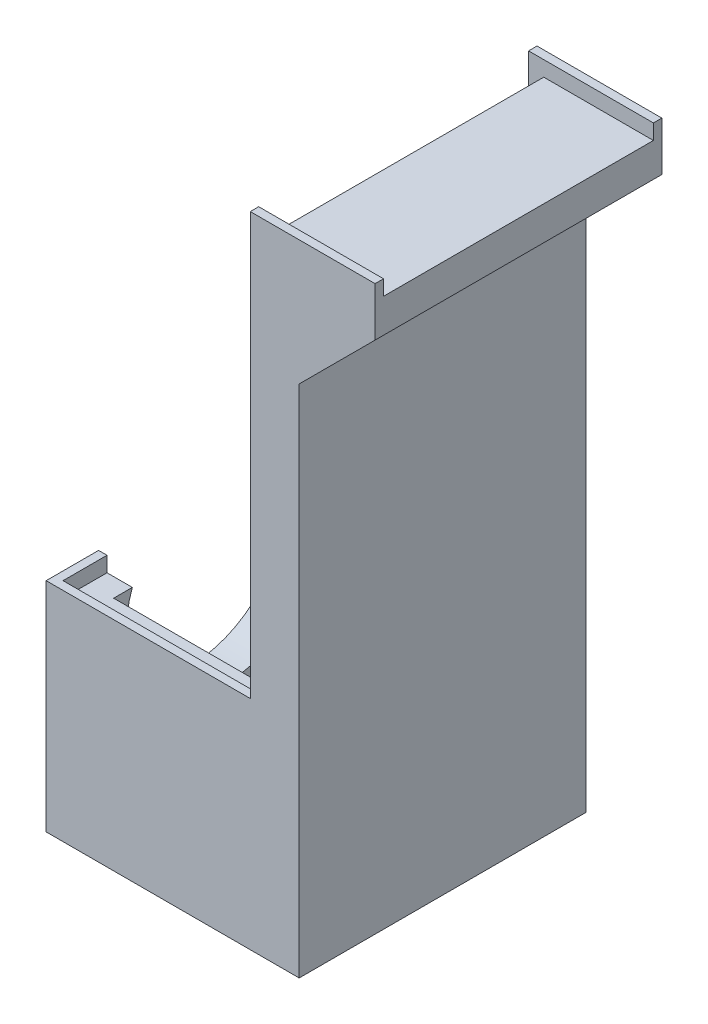
ISO-10303-21;
HEADER;
FILE_DESCRIPTION(('STEP AP214'),'2;1');
FILE_NAME('part.step','',(''),(''),'','','');
FILE_SCHEMA(('AUTOMOTIVE_DESIGN { 1 0 10303 214 1 1 1 1 }'));
ENDSEC;
DATA;
#1=APPLICATION_CONTEXT('core data for automotive mechanical design processes');
#2=APPLICATION_PROTOCOL_DEFINITION('international standard','automotive_design',2000,#1);
#3=PRODUCT_CONTEXT('',#1,'mechanical');
#4=PRODUCT('Part','Part','',(#3));
#5=PRODUCT_RELATED_PRODUCT_CATEGORY('part','',(#4));
#6=PRODUCT_DEFINITION_FORMATION('','',#4);
#7=PRODUCT_DEFINITION_CONTEXT('part definition',#1,'design');
#8=PRODUCT_DEFINITION('design','',#6,#7);
#9=PRODUCT_DEFINITION_SHAPE('','',#8);
#10=(LENGTH_UNIT() NAMED_UNIT(*) SI_UNIT(.MILLI.,.METRE.));
#11=(NAMED_UNIT(*) PLANE_ANGLE_UNIT() SI_UNIT($,.RADIAN.));
#12=(NAMED_UNIT(*) SI_UNIT($,.STERADIAN.) SOLID_ANGLE_UNIT());
#13=UNCERTAINTY_MEASURE_WITH_UNIT(LENGTH_MEASURE(1.E-05),#10,'distance_accuracy_value','');
#14=(GEOMETRIC_REPRESENTATION_CONTEXT(3) GLOBAL_UNCERTAINTY_ASSIGNED_CONTEXT((#13)) GLOBAL_UNIT_ASSIGNED_CONTEXT((#10,
#11,#12)) REPRESENTATION_CONTEXT('',''));
#15=CARTESIAN_POINT('',(0.,0.,0.));
#16=DIRECTION('',(0.,0.,1.));
#17=DIRECTION('',(1.,0.,0.));
#18=AXIS2_PLACEMENT_3D('',#15,#16,#17);
#19=CARTESIAN_POINT('',(8.5,37.,-8.5));
#20=DIRECTION('',(0.,-1.,0.));
#21=DIRECTION('',(0.,0.,-1.));
#22=AXIS2_PLACEMENT_3D('',#19,#20,#21);
#23=PLANE('',#22);
#24=DIRECTION('',(-1.,0.,0.));
#25=VECTOR('',#24,1.);
#26=CARTESIAN_POINT('',(13.,37.,8.));
#27=LINE('',#26,#25);
#28=CARTESIAN_POINT('',(13.,37.,8.));
#29=VERTEX_POINT('',#28);
#30=CARTESIAN_POINT('',(6.5,37.,8.00000000000001));
#31=VERTEX_POINT('',#30);
#32=EDGE_CURVE('E209',#29,#31,#27,.T.);
#33=ORIENTED_EDGE('',*,*,#32,.F.);
#34=DIRECTION('',(0.,0.,1.));
#35=VECTOR('',#34,1.);
#36=CARTESIAN_POINT('',(13.,37.,-8.5));
#37=LINE('',#36,#35);
#38=CARTESIAN_POINT('',(13.,37.,-8.));
#39=VERTEX_POINT('',#38);
#40=EDGE_CURVE('E340',#39,#29,#37,.T.);
#41=ORIENTED_EDGE('',*,*,#40,.F.);
#42=DIRECTION('',(1.,0.,0.));
#43=VECTOR('',#42,1.);
#44=CARTESIAN_POINT('',(13.,37.,-8.));
#45=LINE('',#44,#43);
#46=CARTESIAN_POINT('',(6.5,37.,-8.));
#47=VERTEX_POINT('',#46);
#48=EDGE_CURVE('E11',#47,#39,#45,.T.);
#49=ORIENTED_EDGE('',*,*,#48,.F.);
#50=DIRECTION('',(0.,0.,1.));
#51=VECTOR('',#50,1.);
#52=CARTESIAN_POINT('',(6.5,37.,-8.5));
#53=LINE('',#52,#51);
#54=EDGE_CURVE('E224',#47,#31,#53,.T.);
#55=ORIENTED_EDGE('',*,*,#54,.T.);
#56=EDGE_LOOP('',(#33,#41,#49,#55));
#57=FACE_BOUND('',#56,.T.);
#58=ADVANCED_FACE('F33',(#57),#23,.F.);
#59=CARTESIAN_POINT('',(6.5,0.,0.));
#60=DIRECTION('',(1.,0.,0.));
#61=DIRECTION('',(0.,0.,-1.));
#62=AXIS2_PLACEMENT_3D('',#59,#60,#61);
#63=PLANE('',#62);
#64=DIRECTION('',(0.,-1.,0.));
#65=VECTOR('',#64,1.);
#66=CARTESIAN_POINT('',(6.5,12.9,8.));
#67=LINE('',#66,#65);
#68=CARTESIAN_POINT('',(6.5,12.,8.));
#69=VERTEX_POINT('',#68);
#70=EDGE_CURVE('E328',#31,#69,#67,.T.);
#71=ORIENTED_EDGE('',*,*,#70,.F.);
#72=ORIENTED_EDGE('',*,*,#54,.F.);
#73=DIRECTION('',(0.,-1.,0.));
#74=VECTOR('',#73,1.);
#75=CARTESIAN_POINT('',(6.5,12.9,-8.));
#76=LINE('',#75,#74);
#77=CARTESIAN_POINT('',(6.5,12.,-8.));
#78=VERTEX_POINT('',#77);
#79=EDGE_CURVE('E319',#47,#78,#76,.T.);
#80=ORIENTED_EDGE('',*,*,#79,.T.);
#81=DIRECTION('',(0.,0.,-1.));
#82=VECTOR('',#81,1.);
#83=CARTESIAN_POINT('',(6.5,12.,-8.5));
#84=LINE('',#83,#82);
#85=CARTESIAN_POINT('',(6.5,12.,-6.5));
#86=VERTEX_POINT('',#85);
#87=EDGE_CURVE('E251',#86,#78,#84,.T.);
#88=ORIENTED_EDGE('',*,*,#87,.F.);
#89=DIRECTION('',(0.,-1.,0.));
#90=VECTOR('',#89,1.);
#91=CARTESIAN_POINT('',(6.5,12.,-6.5));
#92=LINE('',#91,#90);
#93=CARTESIAN_POINT('',(6.5,2.,-6.5));
#94=VERTEX_POINT('',#93);
#95=EDGE_CURVE('E254',#86,#94,#92,.T.);
#96=ORIENTED_EDGE('',*,*,#95,.T.);
#97=DIRECTION('',(0.,0.,-1.));
#98=VECTOR('',#97,1.);
#99=CARTESIAN_POINT('',(6.5,2.,-8.5));
#100=LINE('',#99,#98);
#101=CARTESIAN_POINT('',(6.5,2.,6.5));
#102=VERTEX_POINT('',#101);
#103=EDGE_CURVE('E273',#102,#94,#100,.T.);
#104=ORIENTED_EDGE('',*,*,#103,.F.);
#105=DIRECTION('',(0.,-1.,0.));
#106=VECTOR('',#105,1.);
#107=CARTESIAN_POINT('',(6.5,12.,6.5));
#108=LINE('',#107,#106);
#109=CARTESIAN_POINT('',(6.5,12.,6.5));
#110=VERTEX_POINT('',#109);
#111=EDGE_CURVE('E269',#110,#102,#108,.T.);
#112=ORIENTED_EDGE('',*,*,#111,.F.);
#113=DIRECTION('',(0.,0.,-1.));
#114=VECTOR('',#113,1.);
#115=CARTESIAN_POINT('',(6.5,12.,6.5));
#116=LINE('',#115,#114);
#117=EDGE_CURVE('E239',#69,#110,#116,.T.);
#118=ORIENTED_EDGE('',*,*,#117,.F.);
#119=EDGE_LOOP('',(#71,#72,#80,#88,#96,#104,#112,#118));
#120=FACE_BOUND('',#119,.T.);
#121=ADVANCED_FACE('F449',(#120),#63,.F.);
#122=CARTESIAN_POINT('',(0.,12.9,0.));
#123=DIRECTION('',(0.,-1.,0.));
#124=DIRECTION('',(0.,0.,-1.));
#125=AXIS2_PLACEMENT_3D('',#122,#123,#124);
#126=PLANE('',#125);
#127=DIRECTION('',(0.,0.,1.));
#128=VECTOR('',#127,1.);
#129=CARTESIAN_POINT('',(5.6,12.9,-8.5));
#130=LINE('',#129,#128);
#131=CARTESIAN_POINT('',(5.6,12.9,-8.5));
#132=VERTEX_POINT('',#131);
#133=CARTESIAN_POINT('',(5.6,12.9,-8.));
#134=VERTEX_POINT('',#133);
#135=EDGE_CURVE('E391',#132,#134,#130,.T.);
#136=ORIENTED_EDGE('',*,*,#135,.F.);
#137=DIRECTION('',(-1.,0.,0.));
#138=VECTOR('',#137,1.);
#139=CARTESIAN_POINT('',(-6.5,12.9,-8.5));
#140=LINE('',#139,#138);
#141=CARTESIAN_POINT('',(-6.5,12.9,-8.5));
#142=VERTEX_POINT('',#141);
#143=EDGE_CURVE('E428',#132,#142,#140,.T.);
#144=ORIENTED_EDGE('',*,*,#143,.T.);
#145=DIRECTION('',(0.,0.,1.));
#146=VECTOR('',#145,1.);
#147=CARTESIAN_POINT('',(-6.5,12.9,-5.39096466321195));
#148=LINE('',#147,#146);
#149=CARTESIAN_POINT('',(-6.5,12.9,-5.39096466321195));
#150=VERTEX_POINT('',#149);
#151=EDGE_CURVE('E430',#142,#150,#148,.T.);
#152=ORIENTED_EDGE('',*,*,#151,.T.);
#153=DIRECTION('',(1.,0.,0.));
#154=VECTOR('',#153,1.);
#155=CARTESIAN_POINT('',(-6.,12.9,-5.39096466321195));
#156=LINE('',#155,#154);
#157=CARTESIAN_POINT('',(-6.,12.9,-5.39096466321195));
#158=VERTEX_POINT('',#157);
#159=EDGE_CURVE('E335',#150,#158,#156,.T.);
#160=ORIENTED_EDGE('',*,*,#159,.T.);
#161=DIRECTION('',(0.,0.,-1.));
#162=VECTOR('',#161,1.);
#163=CARTESIAN_POINT('',(-6.,12.9,-8.));
#164=LINE('',#163,#162);
#165=CARTESIAN_POINT('',(-6.,12.9,-8.));
#166=VERTEX_POINT('',#165);
#167=EDGE_CURVE('E323',#158,#166,#164,.T.);
#168=ORIENTED_EDGE('',*,*,#167,.T.);
#169=DIRECTION('',(1.,0.,0.));
#170=VECTOR('',#169,1.);
#171=CARTESIAN_POINT('',(6.5,12.9,-8.));
#172=LINE('',#171,#170);
#173=EDGE_CURVE('E326',#166,#134,#172,.T.);
#174=ORIENTED_EDGE('',*,*,#173,.T.);
#175=EDGE_LOOP('',(#136,#144,#152,#160,#168,#174));
#176=FACE_BOUND('',#175,.T.);
#177=ADVANCED_FACE('F433',(#176),#126,.F.);
#178=CARTESIAN_POINT('',(0.,12.,0.));
#179=DIRECTION('',(0.,-1.,0.));
#180=DIRECTION('',(0.,0.,-1.));
#181=AXIS2_PLACEMENT_3D('',#178,#179,#180);
#182=PLANE('',#181);
#183=DIRECTION('',(-1.,0.,0.));
#184=VECTOR('',#183,1.);
#185=CARTESIAN_POINT('',(6.5,12.,8.));
#186=LINE('',#185,#184);
#187=CARTESIAN_POINT('',(-6.,12.,8.));
#188=VERTEX_POINT('',#187);
#189=EDGE_CURVE('E396',#69,#188,#186,.T.);
#190=ORIENTED_EDGE('',*,*,#189,.F.);
#191=ORIENTED_EDGE('',*,*,#117,.T.);
#192=DIRECTION('',(-1.,0.,0.));
#193=VECTOR('',#192,1.);
#194=CARTESIAN_POINT('',(-4.5,12.,6.5));
#195=LINE('',#194,#193);
#196=CARTESIAN_POINT('',(-4.5,12.,6.5));
#197=VERTEX_POINT('',#196);
#198=EDGE_CURVE('E241',#110,#197,#195,.T.);
#199=ORIENTED_EDGE('',*,*,#198,.T.);
#200=DIRECTION('',(0.,0.,-1.));
#201=VECTOR('',#200,1.);
#202=CARTESIAN_POINT('',(-4.5,12.,-6.5));
#203=LINE('',#202,#201);
#204=CARTESIAN_POINT('',(-4.5,12.,5.39096466321196));
#205=VERTEX_POINT('',#204);
#206=EDGE_CURVE('E245',#197,#205,#203,.T.);
#207=ORIENTED_EDGE('',*,*,#206,.T.);
#208=DIRECTION('',(-1.,0.,0.));
#209=VECTOR('',#208,1.);
#210=CARTESIAN_POINT('',(8.5,12.,5.39096466321196));
#211=LINE('',#210,#209);
#212=CARTESIAN_POINT('',(-6.,12.,5.39096466321196));
#213=VERTEX_POINT('',#212);
#214=EDGE_CURVE('E37',#205,#213,#211,.T.);
#215=ORIENTED_EDGE('',*,*,#214,.T.);
#216=DIRECTION('',(0.,0.,-1.));
#217=VECTOR('',#216,1.);
#218=CARTESIAN_POINT('',(-6.,12.,8.));
#219=LINE('',#218,#217);
#220=EDGE_CURVE('E412',#188,#213,#219,.T.);
#221=ORIENTED_EDGE('',*,*,#220,.F.);
#222=EDGE_LOOP('',(#190,#191,#199,#207,#215,#221));
#223=FACE_BOUND('',#222,.T.);
#224=ADVANCED_FACE('F463',(#223),#182,.F.);
#225=DIRECTION('',(0.,0.,-1.));
#226=VECTOR('',#225,1.);
#227=CARTESIAN_POINT('',(-6.,12.,-8.));
#228=LINE('',#227,#226);
#229=CARTESIAN_POINT('',(-6.,12.,-5.39096466321195));
#230=VERTEX_POINT('',#229);
#231=CARTESIAN_POINT('',(-6.,12.,-8.));
#232=VERTEX_POINT('',#231);
#233=EDGE_CURVE('E303',#230,#232,#228,.T.);
#234=ORIENTED_EDGE('',*,*,#233,.F.);
#235=DIRECTION('',(-1.,0.,0.));
#236=VECTOR('',#235,1.);
#237=CARTESIAN_POINT('',(8.5,12.,-5.39096466321196));
#238=LINE('',#237,#236);
#239=CARTESIAN_POINT('',(-4.5,12.,-5.39096466321196));
#240=VERTEX_POINT('',#239);
#241=EDGE_CURVE('E288',#230,#240,#238,.F.);
#242=ORIENTED_EDGE('',*,*,#241,.T.);
#243=CARTESIAN_POINT('',(-4.5,12.,-6.5));
#244=VERTEX_POINT('',#243);
#245=EDGE_CURVE('E244',#240,#244,#203,.T.);
#246=ORIENTED_EDGE('',*,*,#245,.T.);
#247=DIRECTION('',(1.,0.,0.));
#248=VECTOR('',#247,1.);
#249=CARTESIAN_POINT('',(6.5,12.,-6.5));
#250=LINE('',#249,#248);
#251=EDGE_CURVE('E248',#244,#86,#250,.T.);
#252=ORIENTED_EDGE('',*,*,#251,.T.);
#253=ORIENTED_EDGE('',*,*,#87,.T.);
#254=DIRECTION('',(1.,0.,0.));
#255=VECTOR('',#254,1.);
#256=CARTESIAN_POINT('',(6.5,12.,-8.));
#257=LINE('',#256,#255);
#258=EDGE_CURVE('E314',#232,#78,#257,.T.);
#259=ORIENTED_EDGE('',*,*,#258,.F.);
#260=EDGE_LOOP('',(#234,#242,#246,#252,#253,#259));
#261=FACE_BOUND('',#260,.T.);
#262=ADVANCED_FACE('F299',(#261),#182,.F.);
#263=CARTESIAN_POINT('',(0.,2.,0.));
#264=DIRECTION('',(0.,-1.,0.));
#265=DIRECTION('',(0.,0.,-1.));
#266=AXIS2_PLACEMENT_3D('',#263,#264,#265);
#267=PLANE('',#266);
#268=DIRECTION('',(1.,0.,0.));
#269=VECTOR('',#268,1.);
#270=CARTESIAN_POINT('',(6.5,2.,-6.5));
#271=LINE('',#270,#269);
#272=CARTESIAN_POINT('',(-4.5,2.,-6.5));
#273=VERTEX_POINT('',#272);
#274=EDGE_CURVE('E242',#273,#94,#271,.T.);
#275=ORIENTED_EDGE('',*,*,#274,.F.);
#276=DIRECTION('',(0.,0.,-1.));
#277=VECTOR('',#276,1.);
#278=CARTESIAN_POINT('',(-4.5,2.,-6.5));
#279=LINE('',#278,#277);
#280=CARTESIAN_POINT('',(-4.5,2.,6.5));
#281=VERTEX_POINT('',#280);
#282=EDGE_CURVE('E257',#281,#273,#279,.T.);
#283=ORIENTED_EDGE('',*,*,#282,.F.);
#284=DIRECTION('',(-1.,0.,0.));
#285=VECTOR('',#284,1.);
#286=CARTESIAN_POINT('',(-4.5,2.,6.5));
#287=LINE('',#286,#285);
#288=EDGE_CURVE('E238',#102,#281,#287,.T.);
#289=ORIENTED_EDGE('',*,*,#288,.F.);
#290=ORIENTED_EDGE('',*,*,#103,.T.);
#291=EDGE_LOOP('',(#275,#283,#289,#290));
#292=FACE_BOUND('',#291,.T.);
#293=ADVANCED_FACE('F462',(#292),#267,.F.);
#294=CARTESIAN_POINT('',(-6.5,2.,-8.5));
#295=DIRECTION('',(1.,0.,0.));
#296=DIRECTION('',(0.,0.,-1.));
#297=AXIS2_PLACEMENT_3D('',#294,#295,#296);
#298=PLANE('',#297);
#299=DIRECTION('',(0.,-1.,0.));
#300=VECTOR('',#299,1.);
#301=CARTESIAN_POINT('',(-6.5,2.,8.5));
#302=LINE('',#301,#300);
#303=CARTESIAN_POINT('',(-6.5,12.9,8.5));
#304=VERTEX_POINT('',#303);
#305=CARTESIAN_POINT('',(-6.5,0.,8.5));
#306=VERTEX_POINT('',#305);
#307=EDGE_CURVE('E286',#304,#306,#302,.T.);
#308=ORIENTED_EDGE('',*,*,#307,.F.);
#309=DIRECTION('',(0.,0.,1.));
#310=VECTOR('',#309,1.);
#311=CARTESIAN_POINT('',(-6.5,12.9,5.39096466321196));
#312=LINE('',#311,#310);
#313=CARTESIAN_POINT('',(-6.5,12.9,5.39096466321196));
#314=VERTEX_POINT('',#313);
#315=EDGE_CURVE('E404',#314,#304,#312,.T.);
#316=ORIENTED_EDGE('',*,*,#315,.F.);
#317=DIRECTION('',(0.,-1.,0.));
#318=VECTOR('',#317,1.);
#319=CARTESIAN_POINT('',(-6.5,12.9,5.39096466321196));
#320=LINE('',#319,#318);
#321=CARTESIAN_POINT('',(-6.5,12.,5.39096466321196));
#322=VERTEX_POINT('',#321);
#323=EDGE_CURVE('E409',#314,#322,#320,.T.);
#324=ORIENTED_EDGE('',*,*,#323,.T.);
#325=CARTESIAN_POINT('',(-6.5,10.,0.));
#326=DIRECTION('',(-1.,0.,0.));
#327=DIRECTION('',(0.,0.,1.));
#328=AXIS2_PLACEMENT_3D('',#325,#326,#327);
#329=CIRCLE('',#328,5.75);
#330=CARTESIAN_POINT('',(-6.5,12.,-5.39096466321195));
#331=VERTEX_POINT('',#330);
#332=EDGE_CURVE('E232',#331,#322,#329,.T.);
#333=ORIENTED_EDGE('',*,*,#332,.F.);
#334=DIRECTION('',(0.,-1.,0.));
#335=VECTOR('',#334,1.);
#336=CARTESIAN_POINT('',(-6.5,12.9,-5.39096466321195));
#337=LINE('',#336,#335);
#338=EDGE_CURVE('E334',#150,#331,#337,.T.);
#339=ORIENTED_EDGE('',*,*,#338,.F.);
#340=ORIENTED_EDGE('',*,*,#151,.F.);
#341=DIRECTION('',(0.,-1.,0.));
#342=VECTOR('',#341,1.);
#343=CARTESIAN_POINT('',(-6.5,2.,-8.5));
#344=LINE('',#343,#342);
#345=CARTESIAN_POINT('',(-6.5,0.,-8.5));
#346=VERTEX_POINT('',#345);
#347=EDGE_CURVE('E276',#142,#346,#344,.T.);
#348=ORIENTED_EDGE('',*,*,#347,.T.);
#349=DIRECTION('',(0.,0.,1.));
#350=VECTOR('',#349,1.);
#351=CARTESIAN_POINT('',(-6.5,0.,-8.5));
#352=LINE('',#351,#350);
#353=EDGE_CURVE('E272',#346,#306,#352,.T.);
#354=ORIENTED_EDGE('',*,*,#353,.T.);
#355=EDGE_LOOP('',(#308,#316,#324,#333,#339,#340,#348,#354));
#356=FACE_BOUND('',#355,.T.);
#357=ADVANCED_FACE('F35',(#356),#298,.F.);
#358=CARTESIAN_POINT('',(6.5,2.,8.5));
#359=DIRECTION('',(0.,0.,-1.));
#360=DIRECTION('',(-1.,0.,0.));
#361=AXIS2_PLACEMENT_3D('',#358,#359,#360);
#362=PLANE('',#361);
#363=DIRECTION('',(0.,-1.,0.));
#364=VECTOR('',#363,1.);
#365=CARTESIAN_POINT('',(8.5,0.,8.5));
#366=LINE('',#365,#364);
#367=CARTESIAN_POINT('',(8.5,30.4999999999999,8.5));
#368=VERTEX_POINT('',#367);
#369=CARTESIAN_POINT('',(8.5,0.,8.5));
#370=VERTEX_POINT('',#369);
#371=EDGE_CURVE('E223',#368,#370,#366,.T.);
#372=ORIENTED_EDGE('',*,*,#371,.F.);
#373=DIRECTION('',(0.707106781186541,0.707106781186553,0.));
#374=VECTOR('',#373,1.);
#375=CARTESIAN_POINT('',(13.,35.,8.5));
#376=LINE('',#375,#374);
#377=CARTESIAN_POINT('',(13.,35.,8.5));
#378=VERTEX_POINT('',#377);
#379=EDGE_CURVE('E205',#368,#378,#376,.T.);
#380=ORIENTED_EDGE('',*,*,#379,.T.);
#381=DIRECTION('',(0.,-1.,0.));
#382=VECTOR('',#381,1.);
#383=CARTESIAN_POINT('',(13.,37.,8.5));
#384=LINE('',#383,#382);
#385=CARTESIAN_POINT('',(13.,37.9,8.5));
#386=VERTEX_POINT('',#385);
#387=EDGE_CURVE('E342',#386,#378,#384,.T.);
#388=ORIENTED_EDGE('',*,*,#387,.F.);
#389=DIRECTION('',(1.,0.,0.));
#390=VECTOR('',#389,1.);
#391=CARTESIAN_POINT('',(13.,37.9,8.5));
#392=LINE('',#391,#390);
#393=CARTESIAN_POINT('',(5.6,37.9,8.50000000000002));
#394=VERTEX_POINT('',#393);
#395=EDGE_CURVE('E363',#394,#386,#392,.T.);
#396=ORIENTED_EDGE('',*,*,#395,.F.);
#397=DIRECTION('',(0.,1.,0.));
#398=VECTOR('',#397,1.);
#399=CARTESIAN_POINT('',(5.6,12.9,8.5));
#400=LINE('',#399,#398);
#401=CARTESIAN_POINT('',(5.6,12.9,8.5));
#402=VERTEX_POINT('',#401);
#403=EDGE_CURVE('E382',#402,#394,#400,.T.);
#404=ORIENTED_EDGE('',*,*,#403,.F.);
#405=DIRECTION('',(1.,0.,0.));
#406=VECTOR('',#405,1.);
#407=CARTESIAN_POINT('',(-6.5,12.9,8.5));
#408=LINE('',#407,#406);
#409=EDGE_CURVE('E407',#304,#402,#408,.T.);
#410=ORIENTED_EDGE('',*,*,#409,.F.);
#411=ORIENTED_EDGE('',*,*,#307,.T.);
#412=DIRECTION('',(1.,0.,0.));
#413=VECTOR('',#412,1.);
#414=CARTESIAN_POINT('',(6.5,0.,8.5));
#415=LINE('',#414,#413);
#416=EDGE_CURVE('E280',#306,#370,#415,.T.);
#417=ORIENTED_EDGE('',*,*,#416,.T.);
#418=EDGE_LOOP('',(#372,#380,#388,#396,#404,#410,#411,#417));
#419=FACE_BOUND('',#418,.T.);
#420=ADVANCED_FACE('F349',(#419),#362,.F.);
#421=CARTESIAN_POINT('',(6.5,2.,-8.5));
#422=DIRECTION('',(0.,0.,1.));
#423=DIRECTION('',(1.,0.,0.));
#424=AXIS2_PLACEMENT_3D('',#421,#422,#423);
#425=PLANE('',#424);
#426=DIRECTION('',(0.707106781186541,0.707106781186553,0.));
#427=VECTOR('',#426,1.);
#428=CARTESIAN_POINT('',(13.,35.,-8.5));
#429=LINE('',#428,#427);
#430=CARTESIAN_POINT('',(8.5,30.4999999999999,-8.5));
#431=VERTEX_POINT('',#430);
#432=CARTESIAN_POINT('',(13.,35.,-8.5));
#433=VERTEX_POINT('',#432);
#434=EDGE_CURVE('E202',#431,#433,#429,.T.);
#435=ORIENTED_EDGE('',*,*,#434,.F.);
#436=DIRECTION('',(0.,1.,0.));
#437=VECTOR('',#436,1.);
#438=CARTESIAN_POINT('',(8.5,0.,-8.5));
#439=LINE('',#438,#437);
#440=CARTESIAN_POINT('',(8.5,0.,-8.5));
#441=VERTEX_POINT('',#440);
#442=EDGE_CURVE('E215',#441,#431,#439,.T.);
#443=ORIENTED_EDGE('',*,*,#442,.F.);
#444=DIRECTION('',(-1.,0.,0.));
#445=VECTOR('',#444,1.);
#446=CARTESIAN_POINT('',(6.5,0.,-8.5));
#447=LINE('',#446,#445);
#448=EDGE_CURVE('E277',#441,#346,#447,.T.);
#449=ORIENTED_EDGE('',*,*,#448,.T.);
#450=ORIENTED_EDGE('',*,*,#347,.F.);
#451=ORIENTED_EDGE('',*,*,#143,.F.);
#452=DIRECTION('',(0.,-1.,0.));
#453=VECTOR('',#452,1.);
#454=CARTESIAN_POINT('',(5.6,12.9,-8.5));
#455=LINE('',#454,#453);
#456=CARTESIAN_POINT('',(5.6,37.9,-8.49999999999999));
#457=VERTEX_POINT('',#456);
#458=EDGE_CURVE('E388',#457,#132,#455,.T.);
#459=ORIENTED_EDGE('',*,*,#458,.F.);
#460=DIRECTION('',(-1.,0.,0.));
#461=VECTOR('',#460,1.);
#462=CARTESIAN_POINT('',(13.,37.9,-8.5));
#463=LINE('',#462,#461);
#464=CARTESIAN_POINT('',(13.,37.9,-8.5));
#465=VERTEX_POINT('',#464);
#466=EDGE_CURVE('E371',#465,#457,#463,.T.);
#467=ORIENTED_EDGE('',*,*,#466,.F.);
#468=DIRECTION('',(0.,1.,0.));
#469=VECTOR('',#468,1.);
#470=CARTESIAN_POINT('',(13.,37.,-8.5));
#471=LINE('',#470,#469);
#472=EDGE_CURVE('E217',#433,#465,#471,.T.);
#473=ORIENTED_EDGE('',*,*,#472,.F.);
#474=EDGE_LOOP('',(#435,#443,#449,#450,#451,#459,#467,#473));
#475=FACE_BOUND('',#474,.T.);
#476=ADVANCED_FACE('F214',(#475),#425,.F.);
#477=CARTESIAN_POINT('',(0.,0.,0.));
#478=DIRECTION('',(0.,-1.,0.));
#479=DIRECTION('',(0.,0.,-1.));
#480=AXIS2_PLACEMENT_3D('',#477,#478,#479);
#481=PLANE('',#480);
#482=ORIENTED_EDGE('',*,*,#353,.F.);
#483=ORIENTED_EDGE('',*,*,#448,.F.);
#484=DIRECTION('',(0.,0.,-1.));
#485=VECTOR('',#484,1.);
#486=CARTESIAN_POINT('',(8.5,0.,-8.5));
#487=LINE('',#486,#485);
#488=EDGE_CURVE('E222',#370,#441,#487,.T.);
#489=ORIENTED_EDGE('',*,*,#488,.F.);
#490=ORIENTED_EDGE('',*,*,#416,.F.);
#491=EDGE_LOOP('',(#482,#483,#489,#490));
#492=FACE_BOUND('',#491,.T.);
#493=ADVANCED_FACE('F471',(#492),#481,.T.);
#494=CARTESIAN_POINT('',(-4.5,12.,6.5));
#495=DIRECTION('',(0.,0.,1.));
#496=DIRECTION('',(1.,0.,0.));
#497=AXIS2_PLACEMENT_3D('',#494,#495,#496);
#498=PLANE('',#497);
#499=ORIENTED_EDGE('',*,*,#288,.T.);
#500=DIRECTION('',(0.,-1.,0.));
#501=VECTOR('',#500,1.);
#502=CARTESIAN_POINT('',(-4.5,12.,6.5));
#503=LINE('',#502,#501);
#504=EDGE_CURVE('E266',#197,#281,#503,.T.);
#505=ORIENTED_EDGE('',*,*,#504,.F.);
#506=ORIENTED_EDGE('',*,*,#198,.F.);
#507=ORIENTED_EDGE('',*,*,#111,.T.);
#508=EDGE_LOOP('',(#499,#505,#506,#507));
#509=FACE_BOUND('',#508,.T.);
#510=ADVANCED_FACE('F468',(#509),#498,.F.);
#511=CARTESIAN_POINT('',(-4.5,12.,-6.5));
#512=DIRECTION('',(-1.,0.,0.));
#513=DIRECTION('',(0.,0.,1.));
#514=AXIS2_PLACEMENT_3D('',#511,#512,#513);
#515=PLANE('',#514);
#516=ORIENTED_EDGE('',*,*,#245,.F.);
#517=CARTESIAN_POINT('',(-4.5,10.,0.));
#518=DIRECTION('',(-1.,0.,0.));
#519=DIRECTION('',(0.,0.,1.));
#520=AXIS2_PLACEMENT_3D('',#517,#518,#519);
#521=CIRCLE('',#520,5.75);
#522=EDGE_CURVE('E235',#240,#205,#521,.T.);
#523=ORIENTED_EDGE('',*,*,#522,.T.);
#524=ORIENTED_EDGE('',*,*,#206,.F.);
#525=ORIENTED_EDGE('',*,*,#504,.T.);
#526=ORIENTED_EDGE('',*,*,#282,.T.);
#527=DIRECTION('',(0.,-1.,0.));
#528=VECTOR('',#527,1.);
#529=CARTESIAN_POINT('',(-4.5,12.,-6.5));
#530=LINE('',#529,#528);
#531=EDGE_CURVE('E263',#244,#273,#530,.T.);
#532=ORIENTED_EDGE('',*,*,#531,.F.);
#533=EDGE_LOOP('',(#516,#523,#524,#525,#526,#532));
#534=FACE_BOUND('',#533,.T.);
#535=ADVANCED_FACE('F308',(#534),#515,.F.);
#536=CARTESIAN_POINT('',(6.5,12.,-6.5));
#537=DIRECTION('',(0.,0.,-1.));
#538=DIRECTION('',(-1.,0.,0.));
#539=AXIS2_PLACEMENT_3D('',#536,#537,#538);
#540=PLANE('',#539);
#541=ORIENTED_EDGE('',*,*,#274,.T.);
#542=ORIENTED_EDGE('',*,*,#95,.F.);
#543=ORIENTED_EDGE('',*,*,#251,.F.);
#544=ORIENTED_EDGE('',*,*,#531,.T.);
#545=EDGE_LOOP('',(#541,#542,#543,#544));
#546=FACE_BOUND('',#545,.T.);
#547=ADVANCED_FACE('F312',(#546),#540,.F.);
#548=CARTESIAN_POINT('',(8.5,10.,0.));
#549=DIRECTION('',(-1.,0.,0.));
#550=DIRECTION('',(0.,0.,1.));
#551=AXIS2_PLACEMENT_3D('',#548,#549,#550);
#552=CYLINDRICAL_SURFACE('',#551,5.75);
#553=ORIENTED_EDGE('',*,*,#522,.F.);
#554=ORIENTED_EDGE('',*,*,#241,.F.);
#555=EDGE_CURVE('E289',#331,#230,#238,.F.);
#556=ORIENTED_EDGE('',*,*,#555,.F.);
#557=ORIENTED_EDGE('',*,*,#332,.T.);
#558=DIRECTION('',(-1.,0.,0.));
#559=VECTOR('',#558,1.);
#560=CARTESIAN_POINT('',(-6.,12.,5.39096466321196));
#561=LINE('',#560,#559);
#562=EDGE_CURVE('E400',#213,#322,#561,.T.);
#563=ORIENTED_EDGE('',*,*,#562,.F.);
#564=ORIENTED_EDGE('',*,*,#214,.F.);
#565=EDGE_LOOP('',(#553,#554,#556,#557,#563,#564));
#566=FACE_BOUND('',#565,.T.);
#567=ADVANCED_FACE('F305',(#566),#552,.F.);
#568=CARTESIAN_POINT('',(8.5,0.,0.));
#569=DIRECTION('',(1.,0.,0.));
#570=DIRECTION('',(0.,0.,-1.));
#571=AXIS2_PLACEMENT_3D('',#568,#569,#570);
#572=PLANE('',#571);
#573=DIRECTION('',(0.,0.,1.));
#574=VECTOR('',#573,1.);
#575=CARTESIAN_POINT('',(8.5,30.4999999999999,-8.5));
#576=LINE('',#575,#574);
#577=EDGE_CURVE('E199',#431,#368,#576,.T.);
#578=ORIENTED_EDGE('',*,*,#577,.T.);
#579=ORIENTED_EDGE('',*,*,#371,.T.);
#580=ORIENTED_EDGE('',*,*,#488,.T.);
#581=ORIENTED_EDGE('',*,*,#442,.T.);
#582=EDGE_LOOP('',(#578,#579,#580,#581));
#583=FACE_BOUND('',#582,.T.);
#584=ADVANCED_FACE('F220',(#583),#572,.T.);
#585=CARTESIAN_POINT('',(13.,0.,0.));
#586=DIRECTION('',(-1.,0.,0.));
#587=DIRECTION('',(0.,0.,1.));
#588=AXIS2_PLACEMENT_3D('',#585,#586,#587);
#589=PLANE('',#588);
#590=ORIENTED_EDGE('',*,*,#472,.T.);
#591=DIRECTION('',(0.,0.,-1.));
#592=VECTOR('',#591,1.);
#593=CARTESIAN_POINT('',(13.,37.9,-8.5));
#594=LINE('',#593,#592);
#595=CARTESIAN_POINT('',(13.,37.9,-8.));
#596=VERTEX_POINT('',#595);
#597=EDGE_CURVE('E368',#596,#465,#594,.T.);
#598=ORIENTED_EDGE('',*,*,#597,.F.);
#599=DIRECTION('',(0.,-1.,0.));
#600=VECTOR('',#599,1.);
#601=CARTESIAN_POINT('',(13.,37.9,-8.));
#602=LINE('',#601,#600);
#603=EDGE_CURVE('E378',#596,#39,#602,.T.);
#604=ORIENTED_EDGE('',*,*,#603,.T.);
#605=ORIENTED_EDGE('',*,*,#40,.T.);
#606=DIRECTION('',(0.,-1.,0.));
#607=VECTOR('',#606,1.);
#608=CARTESIAN_POINT('',(13.,37.9,8.));
#609=LINE('',#608,#607);
#610=CARTESIAN_POINT('',(13.,37.9,8.));
#611=VERTEX_POINT('',#610);
#612=EDGE_CURVE('E365',#611,#29,#609,.T.);
#613=ORIENTED_EDGE('',*,*,#612,.F.);
#614=DIRECTION('',(0.,0.,-1.));
#615=VECTOR('',#614,1.);
#616=CARTESIAN_POINT('',(13.,37.9,8.5));
#617=LINE('',#616,#615);
#618=EDGE_CURVE('E354',#386,#611,#617,.T.);
#619=ORIENTED_EDGE('',*,*,#618,.F.);
#620=ORIENTED_EDGE('',*,*,#387,.T.);
#621=DIRECTION('',(0.,0.,-1.));
#622=VECTOR('',#621,1.);
#623=CARTESIAN_POINT('',(13.,35.,-8.5));
#624=LINE('',#623,#622);
#625=EDGE_CURVE('E227',#378,#433,#624,.T.);
#626=ORIENTED_EDGE('',*,*,#625,.T.);
#627=EDGE_LOOP('',(#590,#598,#604,#605,#613,#619,#620,#626));
#628=FACE_BOUND('',#627,.T.);
#629=ADVANCED_FACE('F346',(#628),#589,.F.);
#630=CARTESIAN_POINT('',(-6.,12.9,-8.));
#631=DIRECTION('',(-1.,0.,0.));
#632=DIRECTION('',(0.,0.,1.));
#633=AXIS2_PLACEMENT_3D('',#630,#631,#632);
#634=PLANE('',#633);
#635=ORIENTED_EDGE('',*,*,#233,.T.);
#636=DIRECTION('',(0.,-1.,0.));
#637=VECTOR('',#636,1.);
#638=CARTESIAN_POINT('',(-6.,12.9,-8.));
#639=LINE('',#638,#637);
#640=EDGE_CURVE('E322',#166,#232,#639,.T.);
#641=ORIENTED_EDGE('',*,*,#640,.F.);
#642=ORIENTED_EDGE('',*,*,#167,.F.);
#643=DIRECTION('',(0.,-1.,0.));
#644=VECTOR('',#643,1.);
#645=CARTESIAN_POINT('',(-6.,12.9,-5.39096466321195));
#646=LINE('',#645,#644);
#647=EDGE_CURVE('E332',#158,#230,#646,.T.);
#648=ORIENTED_EDGE('',*,*,#647,.T.);
#649=EDGE_LOOP('',(#635,#641,#642,#648));
#650=FACE_BOUND('',#649,.T.);
#651=ADVANCED_FACE('F439',(#650),#634,.F.);
#652=CARTESIAN_POINT('',(6.5,12.9,-8.));
#653=DIRECTION('',(0.,0.,-1.));
#654=DIRECTION('',(-1.,0.,0.));
#655=AXIS2_PLACEMENT_3D('',#652,#653,#654);
#656=PLANE('',#655);
#657=ORIENTED_EDGE('',*,*,#258,.T.);
#658=ORIENTED_EDGE('',*,*,#79,.F.);
#659=ORIENTED_EDGE('',*,*,#48,.T.);
#660=ORIENTED_EDGE('',*,*,#603,.F.);
#661=DIRECTION('',(1.,0.,0.));
#662=VECTOR('',#661,1.);
#663=CARTESIAN_POINT('',(13.,37.9,-8.));
#664=LINE('',#663,#662);
#665=CARTESIAN_POINT('',(5.6,37.9,-7.99999999999998));
#666=VERTEX_POINT('',#665);
#667=EDGE_CURVE('E377',#666,#596,#664,.T.);
#668=ORIENTED_EDGE('',*,*,#667,.F.);
#669=DIRECTION('',(0.,1.,0.));
#670=VECTOR('',#669,1.);
#671=CARTESIAN_POINT('',(5.6,12.9,-8.));
#672=LINE('',#671,#670);
#673=EDGE_CURVE('E394',#134,#666,#672,.T.);
#674=ORIENTED_EDGE('',*,*,#673,.F.);
#675=ORIENTED_EDGE('',*,*,#173,.F.);
#676=ORIENTED_EDGE('',*,*,#640,.T.);
#677=EDGE_LOOP('',(#657,#658,#659,#660,#668,#674,#675,#676));
#678=FACE_BOUND('',#677,.T.);
#679=ADVANCED_FACE('F318',(#678),#656,.F.);
#680=CARTESIAN_POINT('',(-6.,12.9,-5.39096466321195));
#681=DIRECTION('',(0.,0.,-1.));
#682=DIRECTION('',(-1.,0.,0.));
#683=AXIS2_PLACEMENT_3D('',#680,#681,#682);
#684=PLANE('',#683);
#685=ORIENTED_EDGE('',*,*,#555,.T.);
#686=ORIENTED_EDGE('',*,*,#647,.F.);
#687=ORIENTED_EDGE('',*,*,#159,.F.);
#688=ORIENTED_EDGE('',*,*,#338,.T.);
#689=EDGE_LOOP('',(#685,#686,#687,#688));
#690=FACE_BOUND('',#689,.T.);
#691=ADVANCED_FACE('F437',(#690),#684,.F.);
#692=CARTESIAN_POINT('',(6.5,12.9,8.));
#693=DIRECTION('',(0.,0.,1.));
#694=DIRECTION('',(1.,0.,0.));
#695=AXIS2_PLACEMENT_3D('',#692,#693,#694);
#696=PLANE('',#695);
#697=ORIENTED_EDGE('',*,*,#189,.T.);
#698=DIRECTION('',(0.,-1.,0.));
#699=VECTOR('',#698,1.);
#700=CARTESIAN_POINT('',(-6.,12.9,8.));
#701=LINE('',#700,#699);
#702=CARTESIAN_POINT('',(-6.,12.9,8.));
#703=VERTEX_POINT('',#702);
#704=EDGE_CURVE('E422',#703,#188,#701,.T.);
#705=ORIENTED_EDGE('',*,*,#704,.F.);
#706=DIRECTION('',(-1.,0.,0.));
#707=VECTOR('',#706,1.);
#708=CARTESIAN_POINT('',(6.5,12.9,8.));
#709=LINE('',#708,#707);
#710=CARTESIAN_POINT('',(5.6,12.9,8.));
#711=VERTEX_POINT('',#710);
#712=EDGE_CURVE('E397',#711,#703,#709,.T.);
#713=ORIENTED_EDGE('',*,*,#712,.F.);
#714=DIRECTION('',(0.,-1.,0.));
#715=VECTOR('',#714,1.);
#716=CARTESIAN_POINT('',(5.6,12.9,8.));
#717=LINE('',#716,#715);
#718=CARTESIAN_POINT('',(5.6,37.9,8.00000000000001));
#719=VERTEX_POINT('',#718);
#720=EDGE_CURVE('E384',#719,#711,#717,.T.);
#721=ORIENTED_EDGE('',*,*,#720,.F.);
#722=DIRECTION('',(-1.,0.,0.));
#723=VECTOR('',#722,1.);
#724=CARTESIAN_POINT('',(13.,37.9,8.));
#725=LINE('',#724,#723);
#726=EDGE_CURVE('E357',#611,#719,#725,.T.);
#727=ORIENTED_EDGE('',*,*,#726,.F.);
#728=ORIENTED_EDGE('',*,*,#612,.T.);
#729=ORIENTED_EDGE('',*,*,#32,.T.);
#730=ORIENTED_EDGE('',*,*,#70,.T.);
#731=EDGE_LOOP('',(#697,#705,#713,#721,#727,#728,#729,#730));
#732=FACE_BOUND('',#731,.T.);
#733=ADVANCED_FACE('F501',(#732),#696,.F.);
#734=CARTESIAN_POINT('',(-6.,12.9,8.));
#735=DIRECTION('',(-1.,0.,0.));
#736=DIRECTION('',(0.,0.,1.));
#737=AXIS2_PLACEMENT_3D('',#734,#735,#736);
#738=PLANE('',#737);
#739=ORIENTED_EDGE('',*,*,#220,.T.);
#740=DIRECTION('',(0.,-1.,0.));
#741=VECTOR('',#740,1.);
#742=CARTESIAN_POINT('',(-6.,12.9,5.39096466321196));
#743=LINE('',#742,#741);
#744=CARTESIAN_POINT('',(-6.,12.9,5.39096466321196));
#745=VERTEX_POINT('',#744);
#746=EDGE_CURVE('E419',#745,#213,#743,.T.);
#747=ORIENTED_EDGE('',*,*,#746,.F.);
#748=DIRECTION('',(0.,0.,-1.));
#749=VECTOR('',#748,1.);
#750=CARTESIAN_POINT('',(-6.,12.9,8.));
#751=LINE('',#750,#749);
#752=EDGE_CURVE('E399',#703,#745,#751,.T.);
#753=ORIENTED_EDGE('',*,*,#752,.F.);
#754=ORIENTED_EDGE('',*,*,#704,.T.);
#755=EDGE_LOOP('',(#739,#747,#753,#754));
#756=FACE_BOUND('',#755,.T.);
#757=ADVANCED_FACE('F506',(#756),#738,.F.);
#758=CARTESIAN_POINT('',(-6.,12.9,5.39096466321196));
#759=DIRECTION('',(0.,0.,1.));
#760=DIRECTION('',(1.,0.,0.));
#761=AXIS2_PLACEMENT_3D('',#758,#759,#760);
#762=PLANE('',#761);
#763=ORIENTED_EDGE('',*,*,#562,.T.);
#764=ORIENTED_EDGE('',*,*,#323,.F.);
#765=DIRECTION('',(-1.,0.,0.));
#766=VECTOR('',#765,1.);
#767=CARTESIAN_POINT('',(-6.,12.9,5.39096466321196));
#768=LINE('',#767,#766);
#769=EDGE_CURVE('E402',#745,#314,#768,.T.);
#770=ORIENTED_EDGE('',*,*,#769,.F.);
#771=ORIENTED_EDGE('',*,*,#746,.T.);
#772=EDGE_LOOP('',(#763,#764,#770,#771));
#773=FACE_BOUND('',#772,.T.);
#774=ADVANCED_FACE('F508',(#773),#762,.F.);
#775=CARTESIAN_POINT('',(0.,12.9,0.));
#776=DIRECTION('',(0.,1.,0.));
#777=DIRECTION('',(0.,0.,1.));
#778=AXIS2_PLACEMENT_3D('',#775,#776,#777);
#779=PLANE('',#778);
#780=DIRECTION('',(0.,0.,1.));
#781=VECTOR('',#780,1.);
#782=CARTESIAN_POINT('',(5.6,12.9,8.5));
#783=LINE('',#782,#781);
#784=EDGE_CURVE('E49',#711,#402,#783,.T.);
#785=ORIENTED_EDGE('',*,*,#784,.F.);
#786=ORIENTED_EDGE('',*,*,#712,.T.);
#787=ORIENTED_EDGE('',*,*,#752,.T.);
#788=ORIENTED_EDGE('',*,*,#769,.T.);
#789=ORIENTED_EDGE('',*,*,#315,.T.);
#790=ORIENTED_EDGE('',*,*,#409,.T.);
#791=EDGE_LOOP('',(#785,#786,#787,#788,#789,#790));
#792=FACE_BOUND('',#791,.T.);
#793=ADVANCED_FACE('F490',(#792),#779,.T.);
#794=CARTESIAN_POINT('',(5.6,0.,0.));
#795=DIRECTION('',(1.,0.,0.));
#796=DIRECTION('',(0.,0.,-1.));
#797=AXIS2_PLACEMENT_3D('',#794,#795,#796);
#798=PLANE('',#797);
#799=ORIENTED_EDGE('',*,*,#458,.T.);
#800=ORIENTED_EDGE('',*,*,#135,.T.);
#801=ORIENTED_EDGE('',*,*,#673,.T.);
#802=DIRECTION('',(0.,0.,1.));
#803=VECTOR('',#802,1.);
#804=CARTESIAN_POINT('',(5.6,37.9,-8.49999999999999));
#805=LINE('',#804,#803);
#806=EDGE_CURVE('E374',#457,#666,#805,.T.);
#807=ORIENTED_EDGE('',*,*,#806,.F.);
#808=EDGE_LOOP('',(#799,#800,#801,#807));
#809=FACE_BOUND('',#808,.T.);
#810=ADVANCED_FACE('F524',(#809),#798,.F.);
#811=CARTESIAN_POINT('',(5.6,0.,0.));
#812=DIRECTION('',(-1.,0.,0.));
#813=DIRECTION('',(0.,0.,1.));
#814=AXIS2_PLACEMENT_3D('',#811,#812,#813);
#815=PLANE('',#814);
#816=ORIENTED_EDGE('',*,*,#403,.T.);
#817=DIRECTION('',(0.,0.,1.));
#818=VECTOR('',#817,1.);
#819=CARTESIAN_POINT('',(5.6,37.9,8.50000000000002));
#820=LINE('',#819,#818);
#821=EDGE_CURVE('E360',#719,#394,#820,.T.);
#822=ORIENTED_EDGE('',*,*,#821,.F.);
#823=ORIENTED_EDGE('',*,*,#720,.T.);
#824=ORIENTED_EDGE('',*,*,#784,.T.);
#825=EDGE_LOOP('',(#816,#822,#823,#824));
#826=FACE_BOUND('',#825,.T.);
#827=ADVANCED_FACE('F496',(#826),#815,.T.);
#828=CARTESIAN_POINT('',(0.,37.9,0.));
#829=DIRECTION('',(0.,-1.,0.));
#830=DIRECTION('',(0.,0.,-1.));
#831=AXIS2_PLACEMENT_3D('',#828,#829,#830);
#832=PLANE('',#831);
#833=ORIENTED_EDGE('',*,*,#597,.T.);
#834=ORIENTED_EDGE('',*,*,#466,.T.);
#835=ORIENTED_EDGE('',*,*,#806,.T.);
#836=ORIENTED_EDGE('',*,*,#667,.T.);
#837=EDGE_LOOP('',(#833,#834,#835,#836));
#838=FACE_BOUND('',#837,.T.);
#839=ADVANCED_FACE('F521',(#838),#832,.F.);
#840=CARTESIAN_POINT('',(0.,37.9,0.));
#841=DIRECTION('',(0.,1.,0.));
#842=DIRECTION('',(0.,0.,1.));
#843=AXIS2_PLACEMENT_3D('',#840,#841,#842);
#844=PLANE('',#843);
#845=ORIENTED_EDGE('',*,*,#618,.T.);
#846=ORIENTED_EDGE('',*,*,#726,.T.);
#847=ORIENTED_EDGE('',*,*,#821,.T.);
#848=ORIENTED_EDGE('',*,*,#395,.T.);
#849=EDGE_LOOP('',(#845,#846,#847,#848));
#850=FACE_BOUND('',#849,.T.);
#851=ADVANCED_FACE('F498',(#850),#844,.T.);
#852=CARTESIAN_POINT('',(13.,35.,-8.5));
#853=DIRECTION('',(0.707106781186554,-0.707106781186542,0.));
#854=DIRECTION('',(0.707106781186542,0.707106781186554,0.));
#855=AXIS2_PLACEMENT_3D('',#852,#853,#854);
#856=PLANE('',#855);
#857=ORIENTED_EDGE('',*,*,#379,.F.);
#858=ORIENTED_EDGE('',*,*,#577,.F.);
#859=ORIENTED_EDGE('',*,*,#434,.T.);
#860=ORIENTED_EDGE('',*,*,#625,.F.);
#861=EDGE_LOOP('',(#857,#858,#859,#860));
#862=FACE_BOUND('',#861,.T.);
#863=ADVANCED_FACE('F201',(#862),#856,.T.);
#864=CLOSED_SHELL('',(#58,#121,#177,#224,#262,#293,#357,#420,#476,#493,#510,#535,#547,#567,#584,
#629,#651,#679,#691,#733,#757,#774,#793,#810,#827,#839,#851,#863));
#865=MANIFOLD_SOLID_BREP('B2',#864);
#866=ADVANCED_BREP_SHAPE_REPRESENTATION('',(#18,#865),#14);
#867=SHAPE_DEFINITION_REPRESENTATION(#9,#866);
ENDSEC;
END-ISO-10303-21;
